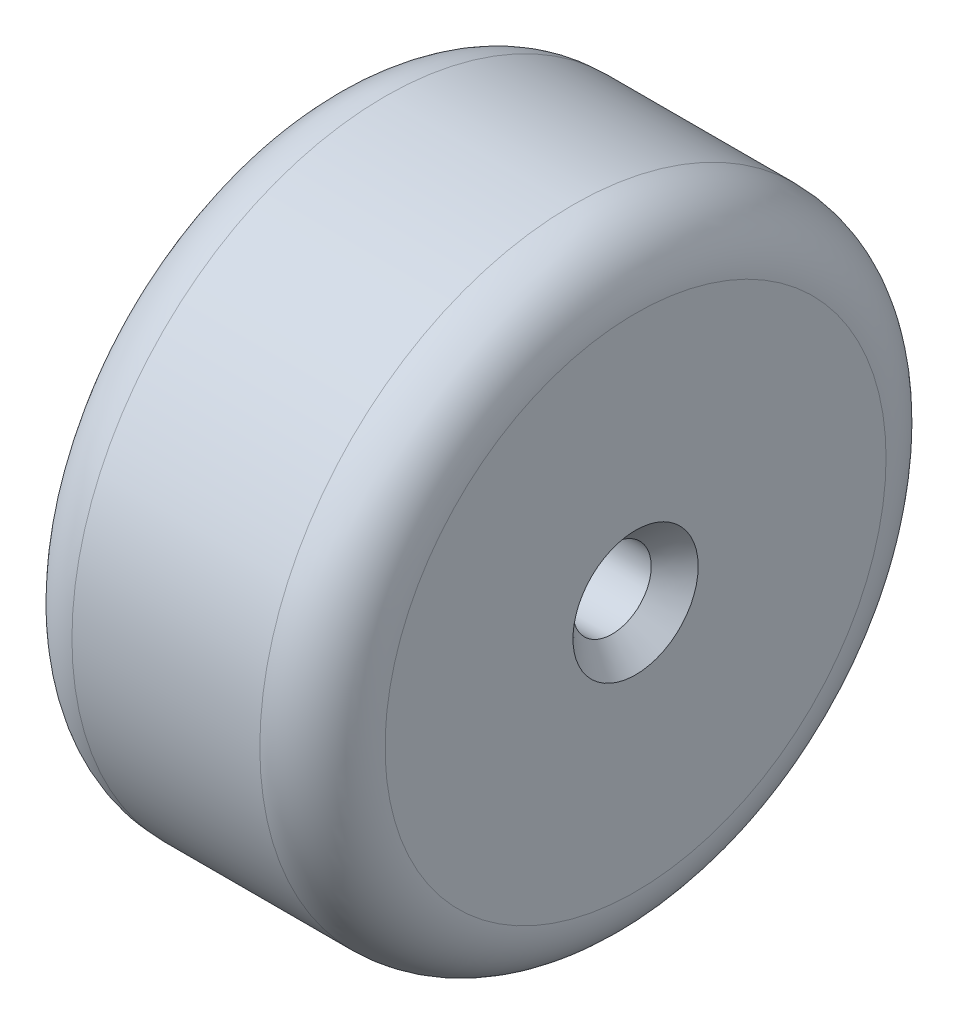
ISO-10303-21;
HEADER;
FILE_DESCRIPTION(('STEP AP214'),'2;1');
FILE_NAME('part.step','',(''),(''),'','','');
FILE_SCHEMA(('AUTOMOTIVE_DESIGN { 1 0 10303 214 1 1 1 1 }'));
ENDSEC;
DATA;
#1=APPLICATION_CONTEXT('core data for automotive mechanical design processes');
#2=APPLICATION_PROTOCOL_DEFINITION('international standard','automotive_design',2000,#1);
#3=PRODUCT_CONTEXT('',#1,'mechanical');
#4=PRODUCT('Part','Part','',(#3));
#5=PRODUCT_RELATED_PRODUCT_CATEGORY('part','',(#4));
#6=PRODUCT_DEFINITION_FORMATION('','',#4);
#7=PRODUCT_DEFINITION_CONTEXT('part definition',#1,'design');
#8=PRODUCT_DEFINITION('design','',#6,#7);
#9=PRODUCT_DEFINITION_SHAPE('','',#8);
#10=(LENGTH_UNIT() NAMED_UNIT(*) SI_UNIT(.MILLI.,.METRE.));
#11=(NAMED_UNIT(*) PLANE_ANGLE_UNIT() SI_UNIT($,.RADIAN.));
#12=(NAMED_UNIT(*) SI_UNIT($,.STERADIAN.) SOLID_ANGLE_UNIT());
#13=UNCERTAINTY_MEASURE_WITH_UNIT(LENGTH_MEASURE(1.E-05),#10,'distance_accuracy_value','');
#14=(GEOMETRIC_REPRESENTATION_CONTEXT(3) GLOBAL_UNCERTAINTY_ASSIGNED_CONTEXT((#13)) GLOBAL_UNIT_ASSIGNED_CONTEXT((#10,
#11,#12)) REPRESENTATION_CONTEXT('',''));
#15=CARTESIAN_POINT('',(0.,0.,0.));
#16=DIRECTION('',(0.,0.,1.));
#17=DIRECTION('',(1.,0.,0.));
#18=AXIS2_PLACEMENT_3D('',#15,#16,#17);
#19=CARTESIAN_POINT('',(40.,0.,0.));
#20=DIRECTION('',(-1.,0.,0.));
#21=DIRECTION('',(0.,0.,1.));
#22=AXIS2_PLACEMENT_3D('',#19,#20,#21);
#23=CYLINDRICAL_SURFACE('',#22,40.);
#24=CARTESIAN_POINT('',(8.,0.,0.));
#25=DIRECTION('',(1.,0.,0.));
#26=DIRECTION('',(0.,0.,-1.));
#27=AXIS2_PLACEMENT_3D('',#24,#25,#26);
#28=CIRCLE('',#27,40.);
#29=CARTESIAN_POINT('',(8.,0.,-40.));
#30=VERTEX_POINT('',#29);
#31=EDGE_CURVE('E72',#30,#30,#28,.T.);
#32=ORIENTED_EDGE('',*,*,#31,.T.);
#33=EDGE_LOOP('',(#32));
#34=FACE_BOUND('',#33,.T.);
#35=CARTESIAN_POINT('',(32.,0.,0.));
#36=DIRECTION('',(1.,0.,0.));
#37=DIRECTION('',(0.,0.,-1.));
#38=AXIS2_PLACEMENT_3D('',#35,#36,#37);
#39=CIRCLE('',#38,40.);
#40=CARTESIAN_POINT('',(32.,0.,-40.));
#41=VERTEX_POINT('',#40);
#42=EDGE_CURVE('E76',#41,#41,#39,.F.);
#43=ORIENTED_EDGE('',*,*,#42,.T.);
#44=EDGE_LOOP('',(#43));
#45=FACE_BOUND('',#44,.T.);
#46=ADVANCED_FACE('F39',(#34,#45),#23,.T.);
#47=CARTESIAN_POINT('',(40.,0.,0.));
#48=DIRECTION('',(1.,0.,0.));
#49=DIRECTION('',(0.,0.,-1.));
#50=AXIS2_PLACEMENT_3D('',#47,#48,#49);
#51=PLANE('',#50);
#52=CARTESIAN_POINT('',(40.,0.,0.));
#53=DIRECTION('',(1.,0.,0.));
#54=DIRECTION('',(0.,0.,-1.));
#55=AXIS2_PLACEMENT_3D('',#52,#53,#54);
#56=CIRCLE('',#55,7.99999999999999);
#57=CARTESIAN_POINT('',(40.,0.,-7.99999999999999));
#58=VERTEX_POINT('',#57);
#59=EDGE_CURVE('E10',#58,#58,#56,.F.);
#60=ORIENTED_EDGE('',*,*,#59,.T.);
#61=EDGE_LOOP('',(#60));
#62=FACE_BOUND('',#61,.T.);
#63=CARTESIAN_POINT('',(40.,0.,0.));
#64=DIRECTION('',(1.,0.,0.));
#65=DIRECTION('',(0.,0.,-1.));
#66=AXIS2_PLACEMENT_3D('',#63,#64,#65);
#67=CIRCLE('',#66,32.);
#68=CARTESIAN_POINT('',(40.,0.,-32.));
#69=VERTEX_POINT('',#68);
#70=EDGE_CURVE('E64',#69,#69,#67,.T.);
#71=ORIENTED_EDGE('',*,*,#70,.T.);
#72=EDGE_LOOP('',(#71));
#73=FACE_BOUND('',#72,.T.);
#74=ADVANCED_FACE('F90',(#62,#73),#51,.T.);
#75=CARTESIAN_POINT('',(0.,0.,0.));
#76=DIRECTION('',(1.,0.,0.));
#77=DIRECTION('',(0.,0.,-1.));
#78=AXIS2_PLACEMENT_3D('',#75,#76,#77);
#79=PLANE('',#78);
#80=CARTESIAN_POINT('',(0.,0.,0.));
#81=DIRECTION('',(1.,0.,0.));
#82=DIRECTION('',(0.,0.,-1.));
#83=AXIS2_PLACEMENT_3D('',#80,#81,#82);
#84=CIRCLE('',#83,8.00000000000001);
#85=CARTESIAN_POINT('',(0.,0.,-8.00000000000001));
#86=VERTEX_POINT('',#85);
#87=EDGE_CURVE('E58',#86,#86,#84,.T.);
#88=ORIENTED_EDGE('',*,*,#87,.T.);
#89=EDGE_LOOP('',(#88));
#90=FACE_BOUND('',#89,.T.);
#91=CARTESIAN_POINT('',(0.,0.,0.));
#92=DIRECTION('',(1.,0.,0.));
#93=DIRECTION('',(0.,0.,-1.));
#94=AXIS2_PLACEMENT_3D('',#91,#92,#93);
#95=CIRCLE('',#94,32.);
#96=CARTESIAN_POINT('',(0.,0.,-32.));
#97=VERTEX_POINT('',#96);
#98=EDGE_CURVE('E68',#97,#97,#95,.F.);
#99=ORIENTED_EDGE('',*,*,#98,.T.);
#100=EDGE_LOOP('',(#99));
#101=FACE_BOUND('',#100,.T.);
#102=ADVANCED_FACE('F92',(#90,#101),#79,.F.);
#103=CARTESIAN_POINT('',(8.,0.,0.));
#104=DIRECTION('',(1.,0.,0.));
#105=DIRECTION('',(0.,0.,-1.));
#106=AXIS2_PLACEMENT_3D('',#103,#104,#105);
#107=TOROIDAL_SURFACE('',#106,32.,8.);
#108=ORIENTED_EDGE('',*,*,#98,.F.);
#109=EDGE_LOOP('',(#108));
#110=FACE_BOUND('',#109,.T.);
#111=ORIENTED_EDGE('',*,*,#31,.F.);
#112=EDGE_LOOP('',(#111));
#113=FACE_BOUND('',#112,.T.);
#114=ADVANCED_FACE('F86',(#110,#113),#107,.T.);
#115=CARTESIAN_POINT('',(32.,0.,0.));
#116=DIRECTION('',(1.,0.,0.));
#117=DIRECTION('',(0.,0.,-1.));
#118=AXIS2_PLACEMENT_3D('',#115,#116,#117);
#119=TOROIDAL_SURFACE('',#118,32.,8.);
#120=ORIENTED_EDGE('',*,*,#42,.F.);
#121=EDGE_LOOP('',(#120));
#122=FACE_BOUND('',#121,.T.);
#123=ORIENTED_EDGE('',*,*,#70,.F.);
#124=EDGE_LOOP('',(#123));
#125=FACE_BOUND('',#124,.T.);
#126=ADVANCED_FACE('F82',(#122,#125),#119,.T.);
#127=CARTESIAN_POINT('',(0.,0.,0.));
#128=DIRECTION('',(1.,0.,0.));
#129=DIRECTION('',(0.,0.,-1.));
#130=AXIS2_PLACEMENT_3D('',#127,#128,#129);
#131=CYLINDRICAL_SURFACE('',#130,5.);
#132=CARTESIAN_POINT('',(3.00000000000002,0.,0.));
#133=DIRECTION('',(1.,0.,0.));
#134=DIRECTION('',(0.,0.,-1.));
#135=AXIS2_PLACEMENT_3D('',#132,#133,#134);
#136=CIRCLE('',#135,5.);
#137=CARTESIAN_POINT('',(3.00000000000002,0.,-5.));
#138=VERTEX_POINT('',#137);
#139=EDGE_CURVE('E48',#138,#138,#136,.F.);
#140=ORIENTED_EDGE('',*,*,#139,.T.);
#141=EDGE_LOOP('',(#140));
#142=FACE_BOUND('',#141,.T.);
#143=CARTESIAN_POINT('',(37.,0.,0.));
#144=DIRECTION('',(1.,0.,0.));
#145=DIRECTION('',(0.,0.,-1.));
#146=AXIS2_PLACEMENT_3D('',#143,#144,#145);
#147=CIRCLE('',#146,5.);
#148=CARTESIAN_POINT('',(37.,0.,-5.));
#149=VERTEX_POINT('',#148);
#150=EDGE_CURVE('E53',#149,#149,#147,.T.);
#151=ORIENTED_EDGE('',*,*,#150,.T.);
#152=EDGE_LOOP('',(#151));
#153=FACE_BOUND('',#152,.T.);
#154=ADVANCED_FACE('F85',(#142,#153),#131,.F.);
#155=CARTESIAN_POINT('',(0.,0.,0.));
#156=DIRECTION('',(-1.,0.,0.));
#157=DIRECTION('',(0.,0.,1.));
#158=AXIS2_PLACEMENT_3D('',#155,#156,#157);
#159=CONICAL_SURFACE('',#158,8.00000000000001,0.785398163397447);
#160=ORIENTED_EDGE('',*,*,#139,.F.);
#161=EDGE_LOOP('',(#160));
#162=FACE_BOUND('',#161,.T.);
#163=ORIENTED_EDGE('',*,*,#87,.F.);
#164=EDGE_LOOP('',(#163));
#165=FACE_BOUND('',#164,.T.);
#166=ADVANCED_FACE('F107',(#162,#165),#159,.F.);
#167=CARTESIAN_POINT('',(37.,0.,0.));
#168=DIRECTION('',(1.,0.,0.));
#169=DIRECTION('',(0.,0.,-1.));
#170=AXIS2_PLACEMENT_3D('',#167,#168,#169);
#171=CONICAL_SURFACE('',#170,5.,0.785398163397452);
#172=ORIENTED_EDGE('',*,*,#59,.F.);
#173=EDGE_LOOP('',(#172));
#174=FACE_BOUND('',#173,.T.);
#175=ORIENTED_EDGE('',*,*,#150,.F.);
#176=EDGE_LOOP('',(#175));
#177=FACE_BOUND('',#176,.T.);
#178=ADVANCED_FACE('F42',(#174,#177),#171,.F.);
#179=CLOSED_SHELL('',(#46,#74,#102,#114,#126,#154,#166,#178));
#180=MANIFOLD_SOLID_BREP('B2',#179);
#181=ADVANCED_BREP_SHAPE_REPRESENTATION('',(#18,#180),#14);
#182=SHAPE_DEFINITION_REPRESENTATION(#9,#181);
ENDSEC;
END-ISO-10303-21;
